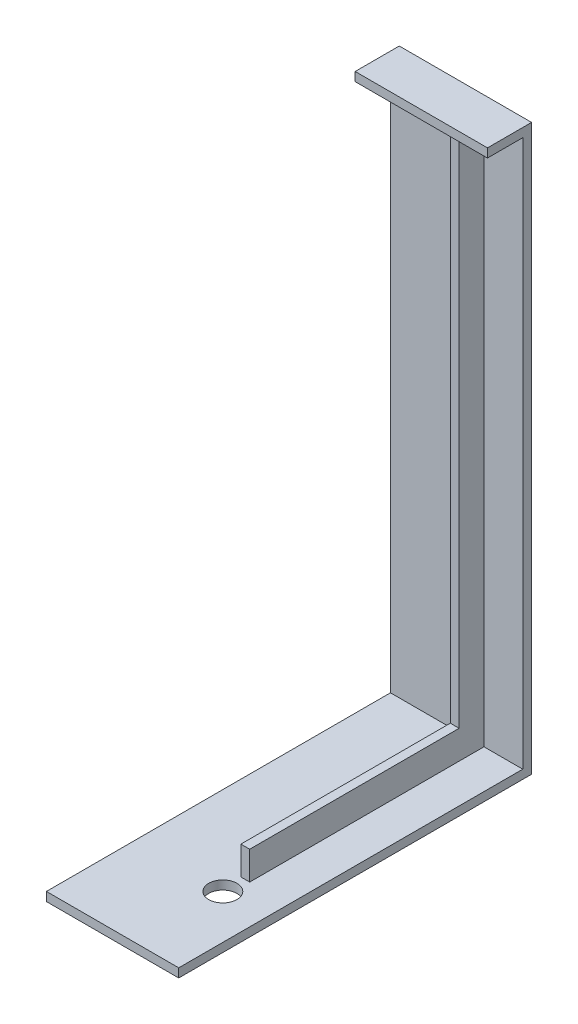
ISO-10303-21;
HEADER;
FILE_DESCRIPTION(('STEP AP214'),'2;1');
FILE_NAME('part.step','',(''),(''),'','','');
FILE_SCHEMA(('AUTOMOTIVE_DESIGN { 1 0 10303 214 1 1 1 1 }'));
ENDSEC;
DATA;
#1=APPLICATION_CONTEXT('core data for automotive mechanical design processes');
#2=APPLICATION_PROTOCOL_DEFINITION('international standard','automotive_design',2000,#1);
#3=PRODUCT_CONTEXT('',#1,'mechanical');
#4=PRODUCT('Part','Part','',(#3));
#5=PRODUCT_RELATED_PRODUCT_CATEGORY('part','',(#4));
#6=PRODUCT_DEFINITION_FORMATION('','',#4);
#7=PRODUCT_DEFINITION_CONTEXT('part definition',#1,'design');
#8=PRODUCT_DEFINITION('design','',#6,#7);
#9=PRODUCT_DEFINITION_SHAPE('','',#8);
#10=(LENGTH_UNIT() NAMED_UNIT(*) SI_UNIT(.MILLI.,.METRE.));
#11=(NAMED_UNIT(*) PLANE_ANGLE_UNIT() SI_UNIT($,.RADIAN.));
#12=(NAMED_UNIT(*) SI_UNIT($,.STERADIAN.) SOLID_ANGLE_UNIT());
#13=UNCERTAINTY_MEASURE_WITH_UNIT(LENGTH_MEASURE(1.E-05),#10,'distance_accuracy_value','');
#14=(GEOMETRIC_REPRESENTATION_CONTEXT(3) GLOBAL_UNCERTAINTY_ASSIGNED_CONTEXT((#13)) GLOBAL_UNIT_ASSIGNED_CONTEXT((#10,
#11,#12)) REPRESENTATION_CONTEXT('',''));
#15=CARTESIAN_POINT('',(0.,0.,0.));
#16=DIRECTION('',(0.,0.,1.));
#17=DIRECTION('',(1.,0.,0.));
#18=AXIS2_PLACEMENT_3D('',#15,#16,#17);
#19=CARTESIAN_POINT('',(-3.94843754696376,63.,1.));
#20=DIRECTION('',(0.,1.,0.));
#21=DIRECTION('',(0.,0.,1.));
#22=AXIS2_PLACEMENT_3D('',#19,#20,#21);
#23=PLANE('',#22);
#24=DIRECTION('',(0.,0.,-1.));
#25=VECTOR('',#24,1.);
#26=CARTESIAN_POINT('',(15.,63.,40.));
#27=LINE('',#26,#25);
#28=CARTESIAN_POINT('',(15.,63.,5.));
#29=VERTEX_POINT('',#28);
#30=CARTESIAN_POINT('',(15.,63.,1.));
#31=VERTEX_POINT('',#30);
#32=EDGE_CURVE('E209',#29,#31,#27,.T.);
#33=ORIENTED_EDGE('',*,*,#32,.F.);
#34=DIRECTION('',(1.,0.,0.));
#35=VECTOR('',#34,1.);
#36=CARTESIAN_POINT('',(-3.94843754696376,63.,5.));
#37=LINE('',#36,#35);
#38=CARTESIAN_POINT('',(0.,63.,5.));
#39=VERTEX_POINT('',#38);
#40=EDGE_CURVE('E43',#39,#29,#37,.T.);
#41=ORIENTED_EDGE('',*,*,#40,.F.);
#42=DIRECTION('',(0.,0.,1.));
#43=VECTOR('',#42,1.);
#44=CARTESIAN_POINT('',(0.,63.,40.));
#45=LINE('',#44,#43);
#46=CARTESIAN_POINT('',(0.,63.,1.));
#47=VERTEX_POINT('',#46);
#48=EDGE_CURVE('E58',#47,#39,#45,.T.);
#49=ORIENTED_EDGE('',*,*,#48,.F.);
#50=DIRECTION('',(-1.,0.,0.));
#51=VECTOR('',#50,1.);
#52=CARTESIAN_POINT('',(-3.94843754696376,63.,1.));
#53=LINE('',#52,#51);
#54=CARTESIAN_POINT('',(9.60511867429442,63.,1.));
#55=VERTEX_POINT('',#54);
#56=EDGE_CURVE('E199',#55,#47,#53,.T.);
#57=ORIENTED_EDGE('',*,*,#56,.F.);
#58=DIRECTION('',(0.,0.,1.));
#59=VECTOR('',#58,1.);
#60=CARTESIAN_POINT('',(9.60511867429442,63.,0.520684092935867));
#61=LINE('',#60,#59);
#62=CARTESIAN_POINT('',(9.60511867429442,63.,3.81787472395015));
#63=VERTEX_POINT('',#62);
#64=EDGE_CURVE('E165',#55,#63,#61,.T.);
#65=ORIENTED_EDGE('',*,*,#64,.T.);
#66=DIRECTION('',(1.,0.,0.));
#67=VECTOR('',#66,1.);
#68=CARTESIAN_POINT('',(-51.3948813257056,63.,3.81787472395016));
#69=LINE('',#68,#67);
#70=CARTESIAN_POINT('',(10.6051186742944,63.,3.81787472395015));
#71=VERTEX_POINT('',#70);
#72=EDGE_CURVE('E147',#63,#71,#69,.T.);
#73=ORIENTED_EDGE('',*,*,#72,.T.);
#74=DIRECTION('',(0.,0.,-1.));
#75=VECTOR('',#74,1.);
#76=CARTESIAN_POINT('',(10.6051186742944,63.,0.520684092935867));
#77=LINE('',#76,#75);
#78=CARTESIAN_POINT('',(10.6051186742944,63.,1.));
#79=VERTEX_POINT('',#78);
#80=EDGE_CURVE('E156',#71,#79,#77,.T.);
#81=ORIENTED_EDGE('',*,*,#80,.T.);
#82=EDGE_CURVE('E200',#31,#79,#53,.T.);
#83=ORIENTED_EDGE('',*,*,#82,.F.);
#84=EDGE_LOOP('',(#33,#41,#49,#57,#65,#73,#81,#83));
#85=FACE_BOUND('',#84,.T.);
#86=ADVANCED_FACE('F35',(#85),#23,.F.);
#87=CARTESIAN_POINT('',(0.,0.,1.));
#88=DIRECTION('',(0.,0.,1.));
#89=DIRECTION('',(1.,0.,0.));
#90=AXIS2_PLACEMENT_3D('',#87,#88,#89);
#91=PLANE('',#90);
#92=DIRECTION('',(1.,0.,0.));
#93=VECTOR('',#92,1.);
#94=CARTESIAN_POINT('',(-3.94843754696375,1.,1.));
#95=LINE('',#94,#93);
#96=CARTESIAN_POINT('',(0.,1.,1.));
#97=VERTEX_POINT('',#96);
#98=CARTESIAN_POINT('',(9.60511867429442,1.,1.));
#99=VERTEX_POINT('',#98);
#100=EDGE_CURVE('E196',#97,#99,#95,.T.);
#101=ORIENTED_EDGE('',*,*,#100,.T.);
#102=DIRECTION('',(0.,1.,0.));
#103=VECTOR('',#102,1.);
#104=CARTESIAN_POINT('',(9.60511867429442,0.,1.));
#105=LINE('',#104,#103);
#106=EDGE_CURVE('E180',#99,#55,#105,.T.);
#107=ORIENTED_EDGE('',*,*,#106,.T.);
#108=ORIENTED_EDGE('',*,*,#56,.T.);
#109=DIRECTION('',(0.,-1.,0.));
#110=VECTOR('',#109,1.);
#111=CARTESIAN_POINT('',(0.,0.,1.));
#112=LINE('',#111,#110);
#113=EDGE_CURVE('E212',#47,#97,#112,.T.);
#114=ORIENTED_EDGE('',*,*,#113,.T.);
#115=EDGE_LOOP('',(#101,#107,#108,#114));
#116=FACE_BOUND('',#115,.T.);
#117=ADVANCED_FACE('F286',(#116),#91,.T.);
#118=ORIENTED_EDGE('',*,*,#82,.T.);
#119=DIRECTION('',(0.,-1.,0.));
#120=VECTOR('',#119,1.);
#121=CARTESIAN_POINT('',(10.6051186742944,0.,1.));
#122=LINE('',#121,#120);
#123=CARTESIAN_POINT('',(10.6051186742944,1.,1.));
#124=VERTEX_POINT('',#123);
#125=EDGE_CURVE('E177',#79,#124,#122,.T.);
#126=ORIENTED_EDGE('',*,*,#125,.T.);
#127=CARTESIAN_POINT('',(15.,1.,1.));
#128=VERTEX_POINT('',#127);
#129=EDGE_CURVE('E195',#124,#128,#95,.T.);
#130=ORIENTED_EDGE('',*,*,#129,.T.);
#131=DIRECTION('',(0.,1.,0.));
#132=VECTOR('',#131,1.);
#133=CARTESIAN_POINT('',(15.,0.,1.));
#134=LINE('',#133,#132);
#135=EDGE_CURVE('E245',#128,#31,#134,.T.);
#136=ORIENTED_EDGE('',*,*,#135,.T.);
#137=EDGE_LOOP('',(#118,#126,#130,#136));
#138=FACE_BOUND('',#137,.T.);
#139=ADVANCED_FACE('F260',(#138),#91,.T.);
#140=CARTESIAN_POINT('',(-3.94843754696375,1.,1.));
#141=DIRECTION('',(0.,-1.,0.));
#142=DIRECTION('',(0.,0.,-1.));
#143=AXIS2_PLACEMENT_3D('',#140,#141,#142);
#144=PLANE('',#143);
#145=CARTESIAN_POINT('',(9.99999999999999,1.,30.));
#146=DIRECTION('',(0.,1.,0.));
#147=DIRECTION('',(0.,0.,1.));
#148=AXIS2_PLACEMENT_3D('',#145,#146,#147);
#149=CIRCLE('',#148,1.6);
#150=CARTESIAN_POINT('',(9.99999999999999,1.,31.6));
#151=VERTEX_POINT('',#150);
#152=EDGE_CURVE('E183',#151,#151,#149,.T.);
#153=ORIENTED_EDGE('',*,*,#152,.F.);
#154=EDGE_LOOP('',(#153));
#155=FACE_BOUND('',#154,.T.);
#156=DIRECTION('',(0.,0.,1.));
#157=VECTOR('',#156,1.);
#158=CARTESIAN_POINT('',(9.60511867429442,1.,0.999999999999999));
#159=LINE('',#158,#157);
#160=CARTESIAN_POINT('',(9.60511867429442,1.,27.5602889461084));
#161=VERTEX_POINT('',#160);
#162=EDGE_CURVE('E11',#99,#161,#159,.T.);
#163=ORIENTED_EDGE('',*,*,#162,.F.);
#164=ORIENTED_EDGE('',*,*,#100,.F.);
#165=DIRECTION('',(0.,0.,-1.));
#166=VECTOR('',#165,1.);
#167=CARTESIAN_POINT('',(0.,1.,40.));
#168=LINE('',#167,#166);
#169=CARTESIAN_POINT('',(0.,1.,40.));
#170=VERTEX_POINT('',#169);
#171=EDGE_CURVE('E206',#170,#97,#168,.T.);
#172=ORIENTED_EDGE('',*,*,#171,.F.);
#173=DIRECTION('',(-1.,0.,0.));
#174=VECTOR('',#173,1.);
#175=CARTESIAN_POINT('',(0.,1.,40.));
#176=LINE('',#175,#174);
#177=CARTESIAN_POINT('',(15.,1.,40.));
#178=VERTEX_POINT('',#177);
#179=EDGE_CURVE('E242',#178,#170,#176,.T.);
#180=ORIENTED_EDGE('',*,*,#179,.F.);
#181=DIRECTION('',(0.,0.,1.));
#182=VECTOR('',#181,1.);
#183=CARTESIAN_POINT('',(15.,1.,40.));
#184=LINE('',#183,#182);
#185=EDGE_CURVE('E203',#128,#178,#184,.T.);
#186=ORIENTED_EDGE('',*,*,#185,.F.);
#187=ORIENTED_EDGE('',*,*,#129,.F.);
#188=DIRECTION('',(0.,0.,-1.));
#189=VECTOR('',#188,1.);
#190=CARTESIAN_POINT('',(10.6051186742944,1.,0.520684092935867));
#191=LINE('',#190,#189);
#192=CARTESIAN_POINT('',(10.6051186742944,1.,27.5602889461084));
#193=VERTEX_POINT('',#192);
#194=EDGE_CURVE('E168',#193,#124,#191,.T.);
#195=ORIENTED_EDGE('',*,*,#194,.F.);
#196=DIRECTION('',(1.,0.,0.));
#197=VECTOR('',#196,1.);
#198=CARTESIAN_POINT('',(9.60511867429442,1.,27.5602889461084));
#199=LINE('',#198,#197);
#200=EDGE_CURVE('E164',#161,#193,#199,.T.);
#201=ORIENTED_EDGE('',*,*,#200,.F.);
#202=EDGE_LOOP('',(#163,#164,#172,#180,#186,#187,#195,#201));
#203=FACE_BOUND('',#202,.T.);
#204=ADVANCED_FACE('F283',(#155,#203),#144,.F.);
#205=CARTESIAN_POINT('',(0.,0.,40.));
#206=DIRECTION('',(1.,0.,0.));
#207=DIRECTION('',(0.,0.,-1.));
#208=AXIS2_PLACEMENT_3D('',#205,#206,#207);
#209=PLANE('',#208);
#210=DIRECTION('',(0.,-1.,0.));
#211=VECTOR('',#210,1.);
#212=CARTESIAN_POINT('',(0.,0.,5.));
#213=LINE('',#212,#211);
#214=CARTESIAN_POINT('',(0.,64.,5.));
#215=VERTEX_POINT('',#214);
#216=EDGE_CURVE('E191',#215,#39,#213,.T.);
#217=ORIENTED_EDGE('',*,*,#216,.F.);
#218=DIRECTION('',(0.,0.,-1.));
#219=VECTOR('',#218,1.);
#220=CARTESIAN_POINT('',(0.,64.,40.));
#221=LINE('',#220,#219);
#222=CARTESIAN_POINT('',(0.,64.,0.));
#223=VERTEX_POINT('',#222);
#224=EDGE_CURVE('E223',#215,#223,#221,.T.);
#225=ORIENTED_EDGE('',*,*,#224,.T.);
#226=DIRECTION('',(0.,-1.,0.));
#227=VECTOR('',#226,1.);
#228=CARTESIAN_POINT('',(0.,0.,0.));
#229=LINE('',#228,#227);
#230=CARTESIAN_POINT('',(0.,0.,0.));
#231=VERTEX_POINT('',#230);
#232=EDGE_CURVE('E214',#223,#231,#229,.T.);
#233=ORIENTED_EDGE('',*,*,#232,.T.);
#234=DIRECTION('',(0.,0.,-1.));
#235=VECTOR('',#234,1.);
#236=CARTESIAN_POINT('',(0.,0.,40.));
#237=LINE('',#236,#235);
#238=CARTESIAN_POINT('',(0.,0.,40.));
#239=VERTEX_POINT('',#238);
#240=EDGE_CURVE('E239',#239,#231,#237,.T.);
#241=ORIENTED_EDGE('',*,*,#240,.F.);
#242=DIRECTION('',(0.,-1.,0.));
#243=VECTOR('',#242,1.);
#244=CARTESIAN_POINT('',(0.,0.,40.));
#245=LINE('',#244,#243);
#246=EDGE_CURVE('E215',#170,#239,#245,.T.);
#247=ORIENTED_EDGE('',*,*,#246,.F.);
#248=ORIENTED_EDGE('',*,*,#171,.T.);
#249=ORIENTED_EDGE('',*,*,#113,.F.);
#250=ORIENTED_EDGE('',*,*,#48,.T.);
#251=EDGE_LOOP('',(#217,#225,#233,#241,#247,#248,#249,#250));
#252=FACE_BOUND('',#251,.T.);
#253=ADVANCED_FACE('F37',(#252),#209,.F.);
#254=CARTESIAN_POINT('',(15.,0.,40.));
#255=DIRECTION('',(-1.,0.,0.));
#256=DIRECTION('',(0.,0.,1.));
#257=AXIS2_PLACEMENT_3D('',#254,#255,#256);
#258=PLANE('',#257);
#259=DIRECTION('',(0.,1.,0.));
#260=VECTOR('',#259,1.);
#261=CARTESIAN_POINT('',(15.,0.,5.));
#262=LINE('',#261,#260);
#263=CARTESIAN_POINT('',(15.,64.,5.));
#264=VERTEX_POINT('',#263);
#265=EDGE_CURVE('E189',#29,#264,#262,.T.);
#266=ORIENTED_EDGE('',*,*,#265,.F.);
#267=ORIENTED_EDGE('',*,*,#32,.T.);
#268=ORIENTED_EDGE('',*,*,#135,.F.);
#269=ORIENTED_EDGE('',*,*,#185,.T.);
#270=DIRECTION('',(0.,1.,0.));
#271=VECTOR('',#270,1.);
#272=CARTESIAN_POINT('',(15.,0.,40.));
#273=LINE('',#272,#271);
#274=CARTESIAN_POINT('',(15.,0.,40.));
#275=VERTEX_POINT('',#274);
#276=EDGE_CURVE('E220',#275,#178,#273,.T.);
#277=ORIENTED_EDGE('',*,*,#276,.F.);
#278=DIRECTION('',(0.,0.,-1.));
#279=VECTOR('',#278,1.);
#280=CARTESIAN_POINT('',(15.,0.,40.));
#281=LINE('',#280,#279);
#282=CARTESIAN_POINT('',(15.,0.,0.));
#283=VERTEX_POINT('',#282);
#284=EDGE_CURVE('E236',#275,#283,#281,.T.);
#285=ORIENTED_EDGE('',*,*,#284,.T.);
#286=DIRECTION('',(0.,1.,0.));
#287=VECTOR('',#286,1.);
#288=CARTESIAN_POINT('',(15.,0.,0.));
#289=LINE('',#288,#287);
#290=CARTESIAN_POINT('',(15.,64.,0.));
#291=VERTEX_POINT('',#290);
#292=EDGE_CURVE('E228',#283,#291,#289,.T.);
#293=ORIENTED_EDGE('',*,*,#292,.T.);
#294=DIRECTION('',(0.,0.,-1.));
#295=VECTOR('',#294,1.);
#296=CARTESIAN_POINT('',(15.,64.,40.));
#297=LINE('',#296,#295);
#298=EDGE_CURVE('E234',#264,#291,#297,.T.);
#299=ORIENTED_EDGE('',*,*,#298,.F.);
#300=EDGE_LOOP('',(#266,#267,#268,#269,#277,#285,#293,#299));
#301=FACE_BOUND('',#300,.T.);
#302=ADVANCED_FACE('F256',(#301),#258,.F.);
#303=CARTESIAN_POINT('',(0.,64.,40.));
#304=DIRECTION('',(0.,-1.,0.));
#305=DIRECTION('',(0.,0.,-1.));
#306=AXIS2_PLACEMENT_3D('',#303,#304,#305);
#307=PLANE('',#306);
#308=DIRECTION('',(-1.,0.,0.));
#309=VECTOR('',#308,1.);
#310=CARTESIAN_POINT('',(0.,64.,5.));
#311=LINE('',#310,#309);
#312=EDGE_CURVE('E193',#264,#215,#311,.T.);
#313=ORIENTED_EDGE('',*,*,#312,.F.);
#314=ORIENTED_EDGE('',*,*,#298,.T.);
#315=DIRECTION('',(-1.,0.,0.));
#316=VECTOR('',#315,1.);
#317=CARTESIAN_POINT('',(0.,64.,0.));
#318=LINE('',#317,#316);
#319=EDGE_CURVE('E218',#291,#223,#318,.T.);
#320=ORIENTED_EDGE('',*,*,#319,.T.);
#321=ORIENTED_EDGE('',*,*,#224,.F.);
#322=EDGE_LOOP('',(#313,#314,#320,#321));
#323=FACE_BOUND('',#322,.T.);
#324=ADVANCED_FACE('F280',(#323),#307,.F.);
#325=CARTESIAN_POINT('',(0.,0.,40.));
#326=DIRECTION('',(0.,1.,0.));
#327=DIRECTION('',(0.,0.,1.));
#328=AXIS2_PLACEMENT_3D('',#325,#326,#327);
#329=PLANE('',#328);
#330=CARTESIAN_POINT('',(9.99999999999999,0.,30.));
#331=DIRECTION('',(0.,1.,0.));
#332=DIRECTION('',(0.,0.,1.));
#333=AXIS2_PLACEMENT_3D('',#330,#331,#332);
#334=CIRCLE('',#333,1.6);
#335=CARTESIAN_POINT('',(9.99999999999999,0.,31.6));
#336=VERTEX_POINT('',#335);
#337=EDGE_CURVE('E186',#336,#336,#334,.T.);
#338=ORIENTED_EDGE('',*,*,#337,.T.);
#339=EDGE_LOOP('',(#338));
#340=FACE_BOUND('',#339,.T.);
#341=DIRECTION('',(1.,0.,0.));
#342=VECTOR('',#341,1.);
#343=CARTESIAN_POINT('',(0.,0.,0.));
#344=LINE('',#343,#342);
#345=EDGE_CURVE('E226',#231,#283,#344,.T.);
#346=ORIENTED_EDGE('',*,*,#345,.T.);
#347=ORIENTED_EDGE('',*,*,#284,.F.);
#348=DIRECTION('',(1.,0.,0.));
#349=VECTOR('',#348,1.);
#350=CARTESIAN_POINT('',(0.,0.,40.));
#351=LINE('',#350,#349);
#352=EDGE_CURVE('E217',#239,#275,#351,.T.);
#353=ORIENTED_EDGE('',*,*,#352,.F.);
#354=ORIENTED_EDGE('',*,*,#240,.T.);
#355=EDGE_LOOP('',(#346,#347,#353,#354));
#356=FACE_BOUND('',#355,.T.);
#357=ADVANCED_FACE('F272',(#340,#356),#329,.F.);
#358=CARTESIAN_POINT('',(0.,0.,40.));
#359=DIRECTION('',(0.,0.,-1.));
#360=DIRECTION('',(-1.,0.,0.));
#361=AXIS2_PLACEMENT_3D('',#358,#359,#360);
#362=PLANE('',#361);
#363=ORIENTED_EDGE('',*,*,#276,.T.);
#364=ORIENTED_EDGE('',*,*,#179,.T.);
#365=ORIENTED_EDGE('',*,*,#246,.T.);
#366=ORIENTED_EDGE('',*,*,#352,.T.);
#367=EDGE_LOOP('',(#363,#364,#365,#366));
#368=FACE_BOUND('',#367,.T.);
#369=ADVANCED_FACE('F266',(#368),#362,.F.);
#370=CARTESIAN_POINT('',(0.,0.,0.));
#371=DIRECTION('',(0.,0.,-1.));
#372=DIRECTION('',(-1.,0.,0.));
#373=AXIS2_PLACEMENT_3D('',#370,#371,#372);
#374=PLANE('',#373);
#375=ORIENTED_EDGE('',*,*,#232,.F.);
#376=ORIENTED_EDGE('',*,*,#319,.F.);
#377=ORIENTED_EDGE('',*,*,#292,.F.);
#378=ORIENTED_EDGE('',*,*,#345,.F.);
#379=EDGE_LOOP('',(#375,#376,#377,#378));
#380=FACE_BOUND('',#379,.T.);
#381=ADVANCED_FACE('F277',(#380),#374,.T.);
#382=CARTESIAN_POINT('',(0.,0.,5.));
#383=DIRECTION('',(0.,0.,1.));
#384=DIRECTION('',(1.,0.,0.));
#385=AXIS2_PLACEMENT_3D('',#382,#383,#384);
#386=PLANE('',#385);
#387=ORIENTED_EDGE('',*,*,#312,.T.);
#388=ORIENTED_EDGE('',*,*,#216,.T.);
#389=ORIENTED_EDGE('',*,*,#40,.T.);
#390=ORIENTED_EDGE('',*,*,#265,.T.);
#391=EDGE_LOOP('',(#387,#388,#389,#390));
#392=FACE_BOUND('',#391,.T.);
#393=ADVANCED_FACE('F250',(#392),#386,.T.);
#394=CARTESIAN_POINT('',(9.99999999999999,-34.,30.));
#395=DIRECTION('',(0.,1.,0.));
#396=DIRECTION('',(0.,0.,1.));
#397=AXIS2_PLACEMENT_3D('',#394,#395,#396);
#398=CYLINDRICAL_SURFACE('',#397,1.6);
#399=ORIENTED_EDGE('',*,*,#152,.T.);
#400=EDGE_LOOP('',(#399));
#401=FACE_BOUND('',#400,.T.);
#402=ORIENTED_EDGE('',*,*,#337,.F.);
#403=EDGE_LOOP('',(#402));
#404=FACE_BOUND('',#403,.T.);
#405=ADVANCED_FACE('F301',(#401,#404),#398,.F.);
#406=CARTESIAN_POINT('',(9.60511867429442,63.,0.520684092935867));
#407=DIRECTION('',(1.,0.,0.));
#408=DIRECTION('',(0.,0.,-1.));
#409=AXIS2_PLACEMENT_3D('',#406,#407,#408);
#410=PLANE('',#409);
#411=DIRECTION('',(0.,0.,-1.));
#412=VECTOR('',#411,1.);
#413=CARTESIAN_POINT('',(9.60511867429442,4.22755754642198,0.520684092935867));
#414=LINE('',#413,#412);
#415=CARTESIAN_POINT('',(9.60511867429442,4.22755754642198,27.5602889461084));
#416=VERTEX_POINT('',#415);
#417=CARTESIAN_POINT('',(9.60511867429442,4.22755754642198,3.81787472395015));
#418=VERTEX_POINT('',#417);
#419=EDGE_CURVE('E160',#416,#418,#414,.T.);
#420=ORIENTED_EDGE('',*,*,#419,.T.);
#421=DIRECTION('',(0.,1.,0.));
#422=VECTOR('',#421,1.);
#423=CARTESIAN_POINT('',(9.60511867429442,63.,3.81787472395015));
#424=LINE('',#423,#422);
#425=EDGE_CURVE('E145',#418,#63,#424,.T.);
#426=ORIENTED_EDGE('',*,*,#425,.T.);
#427=ORIENTED_EDGE('',*,*,#64,.F.);
#428=ORIENTED_EDGE('',*,*,#106,.F.);
#429=ORIENTED_EDGE('',*,*,#162,.T.);
#430=DIRECTION('',(0.,-1.,0.));
#431=VECTOR('',#430,1.);
#432=CARTESIAN_POINT('',(9.60511867429442,63.,27.5602889461084));
#433=LINE('',#432,#431);
#434=EDGE_CURVE('E175',#416,#161,#433,.T.);
#435=ORIENTED_EDGE('',*,*,#434,.F.);
#436=EDGE_LOOP('',(#420,#426,#427,#428,#429,#435));
#437=FACE_BOUND('',#436,.T.);
#438=ADVANCED_FACE('F289',(#437),#410,.F.);
#439=CARTESIAN_POINT('',(9.60511867429442,63.,27.5602889461084));
#440=DIRECTION('',(0.,0.,-1.));
#441=DIRECTION('',(-1.,0.,0.));
#442=AXIS2_PLACEMENT_3D('',#439,#440,#441);
#443=PLANE('',#442);
#444=DIRECTION('',(0.,-1.,0.));
#445=VECTOR('',#444,1.);
#446=CARTESIAN_POINT('',(10.6051186742944,63.,27.5602889461084));
#447=LINE('',#446,#445);
#448=CARTESIAN_POINT('',(10.6051186742944,4.22755754642198,27.5602889461084));
#449=VERTEX_POINT('',#448);
#450=EDGE_CURVE('E170',#449,#193,#447,.T.);
#451=ORIENTED_EDGE('',*,*,#450,.F.);
#452=DIRECTION('',(1.,0.,0.));
#453=VECTOR('',#452,1.);
#454=CARTESIAN_POINT('',(-51.3948813257056,4.22755754642198,27.5602889461084));
#455=LINE('',#454,#453);
#456=EDGE_CURVE('E50',#416,#449,#455,.T.);
#457=ORIENTED_EDGE('',*,*,#456,.F.);
#458=ORIENTED_EDGE('',*,*,#434,.T.);
#459=ORIENTED_EDGE('',*,*,#200,.T.);
#460=EDGE_LOOP('',(#451,#457,#458,#459));
#461=FACE_BOUND('',#460,.T.);
#462=ADVANCED_FACE('F292',(#461),#443,.F.);
#463=CARTESIAN_POINT('',(10.6051186742944,63.,0.520684092935867));
#464=DIRECTION('',(-1.,0.,0.));
#465=DIRECTION('',(0.,0.,1.));
#466=AXIS2_PLACEMENT_3D('',#463,#464,#465);
#467=PLANE('',#466);
#468=ORIENTED_EDGE('',*,*,#80,.F.);
#469=DIRECTION('',(0.,1.,0.));
#470=VECTOR('',#469,1.);
#471=CARTESIAN_POINT('',(10.6051186742944,63.,3.81787472395015));
#472=LINE('',#471,#470);
#473=CARTESIAN_POINT('',(10.6051186742944,4.22755754642198,3.81787472395015));
#474=VERTEX_POINT('',#473);
#475=EDGE_CURVE('E142',#474,#71,#472,.T.);
#476=ORIENTED_EDGE('',*,*,#475,.F.);
#477=DIRECTION('',(0.,0.,-1.));
#478=VECTOR('',#477,1.);
#479=CARTESIAN_POINT('',(10.6051186742944,4.22755754642198,27.5602889461084));
#480=LINE('',#479,#478);
#481=EDGE_CURVE('E149',#449,#474,#480,.T.);
#482=ORIENTED_EDGE('',*,*,#481,.F.);
#483=ORIENTED_EDGE('',*,*,#450,.T.);
#484=ORIENTED_EDGE('',*,*,#194,.T.);
#485=ORIENTED_EDGE('',*,*,#125,.F.);
#486=EDGE_LOOP('',(#468,#476,#482,#483,#484,#485));
#487=FACE_BOUND('',#486,.T.);
#488=ADVANCED_FACE('F154',(#487),#467,.F.);
#489=CARTESIAN_POINT('',(-51.3948813257056,63.,3.81787472395016));
#490=DIRECTION('',(0.,0.,-1.));
#491=DIRECTION('',(-1.,0.,0.));
#492=AXIS2_PLACEMENT_3D('',#489,#490,#491);
#493=PLANE('',#492);
#494=DIRECTION('',(1.,0.,0.));
#495=VECTOR('',#494,1.);
#496=CARTESIAN_POINT('',(-51.3948813257056,4.22755754642198,3.81787472395016));
#497=LINE('',#496,#495);
#498=EDGE_CURVE('E139',#418,#474,#497,.T.);
#499=ORIENTED_EDGE('',*,*,#498,.T.);
#500=ORIENTED_EDGE('',*,*,#475,.T.);
#501=ORIENTED_EDGE('',*,*,#72,.F.);
#502=ORIENTED_EDGE('',*,*,#425,.F.);
#503=EDGE_LOOP('',(#499,#500,#501,#502));
#504=FACE_BOUND('',#503,.T.);
#505=ADVANCED_FACE('F140',(#504),#493,.F.);
#506=CARTESIAN_POINT('',(-51.3948813257056,4.22755754642198,27.5602889461084));
#507=DIRECTION('',(0.,-1.,0.));
#508=DIRECTION('',(0.,0.,-1.));
#509=AXIS2_PLACEMENT_3D('',#506,#507,#508);
#510=PLANE('',#509);
#511=ORIENTED_EDGE('',*,*,#456,.T.);
#512=ORIENTED_EDGE('',*,*,#481,.T.);
#513=ORIENTED_EDGE('',*,*,#498,.F.);
#514=ORIENTED_EDGE('',*,*,#419,.F.);
#515=EDGE_LOOP('',(#511,#512,#513,#514));
#516=FACE_BOUND('',#515,.T.);
#517=ADVANCED_FACE('F150',(#516),#510,.F.);
#518=CLOSED_SHELL('',(#86,#117,#139,#204,#253,#302,#324,#357,#369,#381,#393,#405,#438,#462,#488,
#505,#517));
#519=MANIFOLD_SOLID_BREP('B2',#518);
#520=ADVANCED_BREP_SHAPE_REPRESENTATION('',(#18,#519),#14);
#521=SHAPE_DEFINITION_REPRESENTATION(#9,#520);
ENDSEC;
END-ISO-10303-21;
